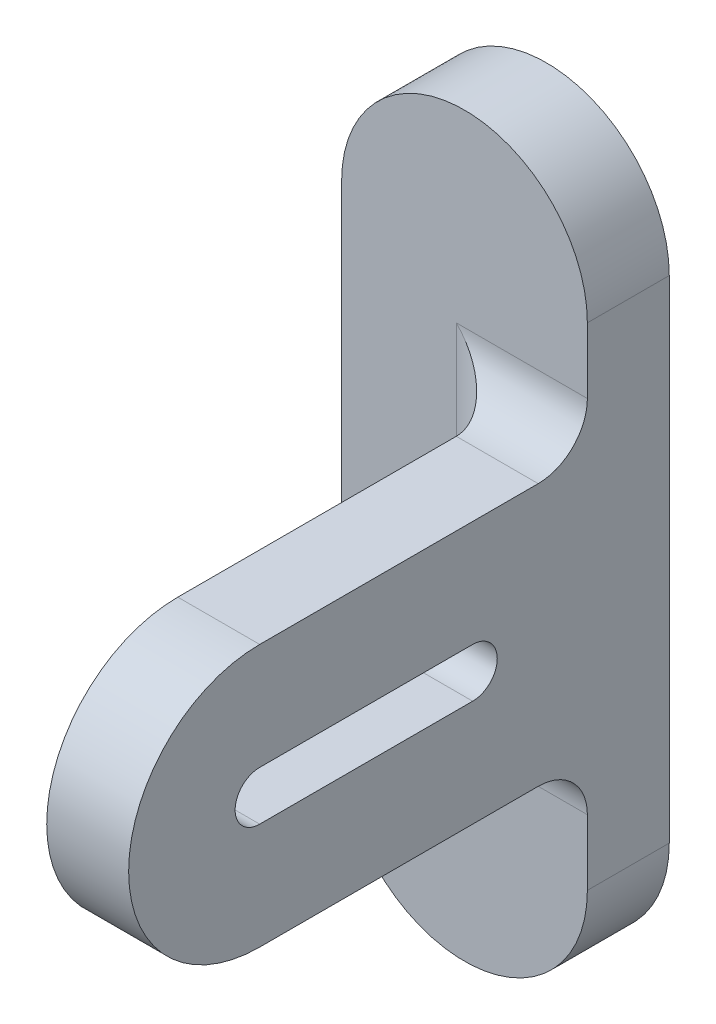
ISO-10303-21;
HEADER;
FILE_DESCRIPTION(('STEP AP214'),'2;1');
FILE_NAME('part.step','',(''),(''),'','','');
FILE_SCHEMA(('AUTOMOTIVE_DESIGN { 1 0 10303 214 1 1 1 1 }'));
ENDSEC;
DATA;
#1=APPLICATION_CONTEXT('core data for automotive mechanical design processes');
#2=APPLICATION_PROTOCOL_DEFINITION('international standard','automotive_design',2000,#1);
#3=PRODUCT_CONTEXT('',#1,'mechanical');
#4=PRODUCT('Part','Part','',(#3));
#5=PRODUCT_RELATED_PRODUCT_CATEGORY('part','',(#4));
#6=PRODUCT_DEFINITION_FORMATION('','',#4);
#7=PRODUCT_DEFINITION_CONTEXT('part definition',#1,'design');
#8=PRODUCT_DEFINITION('design','',#6,#7);
#9=PRODUCT_DEFINITION_SHAPE('','',#8);
#10=(LENGTH_UNIT() NAMED_UNIT(*) SI_UNIT(.MILLI.,.METRE.));
#11=(NAMED_UNIT(*) PLANE_ANGLE_UNIT() SI_UNIT($,.RADIAN.));
#12=(NAMED_UNIT(*) SI_UNIT($,.STERADIAN.) SOLID_ANGLE_UNIT());
#13=UNCERTAINTY_MEASURE_WITH_UNIT(LENGTH_MEASURE(1.E-05),#10,'distance_accuracy_value','');
#14=(GEOMETRIC_REPRESENTATION_CONTEXT(3) GLOBAL_UNCERTAINTY_ASSIGNED_CONTEXT((#13)) GLOBAL_UNIT_ASSIGNED_CONTEXT((#10,
#11,#12)) REPRESENTATION_CONTEXT('',''));
#15=CARTESIAN_POINT('',(0.,0.,0.));
#16=DIRECTION('',(0.,0.,1.));
#17=DIRECTION('',(1.,0.,0.));
#18=AXIS2_PLACEMENT_3D('',#15,#16,#17);
#19=CARTESIAN_POINT('',(-20.6017573210977,110.493831222237,5.));
#20=DIRECTION('',(0.,0.,-1.));
#21=DIRECTION('',(-1.,0.,0.));
#22=AXIS2_PLACEMENT_3D('',#19,#20,#21);
#23=CYLINDRICAL_SURFACE('',#22,7.5);
#24=CARTESIAN_POINT('',(-20.6017573210977,110.493831222237,0.));
#25=DIRECTION('',(0.,0.,1.));
#26=DIRECTION('',(1.,0.,0.));
#27=AXIS2_PLACEMENT_3D('',#24,#25,#26);
#28=CIRCLE('',#27,7.5);
#29=CARTESIAN_POINT('',(-13.1017573210977,110.493831222237,0.));
#30=VERTEX_POINT('',#29);
#31=CARTESIAN_POINT('',(-28.1017573210977,110.493831222237,0.));
#32=VERTEX_POINT('',#31);
#33=EDGE_CURVE('E233',#30,#32,#28,.T.);
#34=ORIENTED_EDGE('',*,*,#33,.T.);
#35=DIRECTION('',(0.,0.,-1.));
#36=VECTOR('',#35,1.);
#37=CARTESIAN_POINT('',(-28.1017573210977,110.493831222237,5.));
#38=LINE('',#37,#36);
#39=CARTESIAN_POINT('',(-28.1017573210977,110.493831222237,5.));
#40=VERTEX_POINT('',#39);
#41=EDGE_CURVE('E272',#40,#32,#38,.T.);
#42=ORIENTED_EDGE('',*,*,#41,.F.);
#43=CARTESIAN_POINT('',(-20.6017573210977,110.493831222237,5.));
#44=DIRECTION('',(0.,0.,1.));
#45=DIRECTION('',(1.,0.,0.));
#46=AXIS2_PLACEMENT_3D('',#43,#44,#45);
#47=CIRCLE('',#46,7.5);
#48=CARTESIAN_POINT('',(-13.1017573210977,110.493831222237,5.));
#49=VERTEX_POINT('',#48);
#50=EDGE_CURVE('E235',#49,#40,#47,.T.);
#51=ORIENTED_EDGE('',*,*,#50,.F.);
#52=DIRECTION('',(0.,0.,-1.));
#53=VECTOR('',#52,1.);
#54=CARTESIAN_POINT('',(-13.1017573210977,110.493831222237,5.));
#55=LINE('',#54,#53);
#56=EDGE_CURVE('E247',#49,#30,#55,.T.);
#57=ORIENTED_EDGE('',*,*,#56,.T.);
#58=EDGE_LOOP('',(#34,#42,#51,#57));
#59=FACE_BOUND('',#58,.T.);
#60=ADVANCED_FACE('F44',(#59),#23,.T.);
#61=CARTESIAN_POINT('',(-28.1017573210977,110.493831222237,5.));
#62=DIRECTION('',(1.,0.,0.));
#63=DIRECTION('',(0.,0.,-1.));
#64=AXIS2_PLACEMENT_3D('',#61,#62,#63);
#65=PLANE('',#64);
#66=DIRECTION('',(0.,-1.,0.));
#67=VECTOR('',#66,1.);
#68=CARTESIAN_POINT('',(-28.1017573210977,110.493831222237,0.));
#69=LINE('',#68,#67);
#70=CARTESIAN_POINT('',(-28.1017573210977,80.4938312222369,0.));
#71=VERTEX_POINT('',#70);
#72=EDGE_CURVE('E255',#32,#71,#69,.T.);
#73=ORIENTED_EDGE('',*,*,#72,.T.);
#74=DIRECTION('',(0.,0.,-1.));
#75=VECTOR('',#74,1.);
#76=CARTESIAN_POINT('',(-28.1017573210977,80.4938312222369,5.));
#77=LINE('',#76,#75);
#78=CARTESIAN_POINT('',(-28.1017573210977,80.4938312222369,5.));
#79=VERTEX_POINT('',#78);
#80=EDGE_CURVE('E270',#79,#71,#77,.T.);
#81=ORIENTED_EDGE('',*,*,#80,.F.);
#82=DIRECTION('',(0.,-1.,0.));
#83=VECTOR('',#82,1.);
#84=CARTESIAN_POINT('',(-28.1017573210977,110.493831222237,5.));
#85=LINE('',#84,#83);
#86=EDGE_CURVE('E236',#40,#79,#85,.T.);
#87=ORIENTED_EDGE('',*,*,#86,.F.);
#88=ORIENTED_EDGE('',*,*,#41,.T.);
#89=EDGE_LOOP('',(#73,#81,#87,#88));
#90=FACE_BOUND('',#89,.T.);
#91=ADVANCED_FACE('F325',(#90),#65,.F.);
#92=CARTESIAN_POINT('',(-20.6017573210977,80.4938312222369,5.));
#93=DIRECTION('',(0.,0.,-1.));
#94=DIRECTION('',(-1.,0.,0.));
#95=AXIS2_PLACEMENT_3D('',#92,#93,#94);
#96=CYLINDRICAL_SURFACE('',#95,7.50000000000001);
#97=CARTESIAN_POINT('',(-20.6017573210977,80.4938312222369,0.));
#98=DIRECTION('',(0.,0.,1.));
#99=DIRECTION('',(1.,0.,0.));
#100=AXIS2_PLACEMENT_3D('',#97,#98,#99);
#101=CIRCLE('',#100,7.50000000000001);
#102=CARTESIAN_POINT('',(-13.1017573210977,80.4938312222369,0.));
#103=VERTEX_POINT('',#102);
#104=EDGE_CURVE('E253',#71,#103,#101,.T.);
#105=ORIENTED_EDGE('',*,*,#104,.T.);
#106=DIRECTION('',(0.,0.,-1.));
#107=VECTOR('',#106,1.);
#108=CARTESIAN_POINT('',(-13.1017573210977,80.4938312222369,5.));
#109=LINE('',#108,#107);
#110=CARTESIAN_POINT('',(-13.1017573210977,80.4938312222369,5.));
#111=VERTEX_POINT('',#110);
#112=EDGE_CURVE('E264',#111,#103,#109,.T.);
#113=ORIENTED_EDGE('',*,*,#112,.F.);
#114=CARTESIAN_POINT('',(-20.6017573210977,80.4938312222369,5.));
#115=DIRECTION('',(0.,0.,1.));
#116=DIRECTION('',(1.,0.,0.));
#117=AXIS2_PLACEMENT_3D('',#114,#115,#116);
#118=CIRCLE('',#117,7.50000000000001);
#119=EDGE_CURVE('E239',#79,#111,#118,.T.);
#120=ORIENTED_EDGE('',*,*,#119,.F.);
#121=ORIENTED_EDGE('',*,*,#80,.T.);
#122=EDGE_LOOP('',(#105,#113,#120,#121));
#123=FACE_BOUND('',#122,.T.);
#124=ADVANCED_FACE('F323',(#123),#96,.T.);
#125=CARTESIAN_POINT('',(-13.1017573210977,110.493831222237,5.));
#126=DIRECTION('',(-1.,0.,0.));
#127=DIRECTION('',(0.,-1.,0.));
#128=AXIS2_PLACEMENT_3D('',#125,#126,#127);
#129=PLANE('',#128);
#130=DIRECTION('',(0.,1.,0.));
#131=VECTOR('',#130,1.);
#132=CARTESIAN_POINT('',(-13.1017573210977,110.493831222237,0.));
#133=LINE('',#132,#131);
#134=EDGE_CURVE('E240',#103,#30,#133,.T.);
#135=ORIENTED_EDGE('',*,*,#134,.T.);
#136=ORIENTED_EDGE('',*,*,#56,.F.);
#137=DIRECTION('',(0.,1.,0.));
#138=VECTOR('',#137,1.);
#139=CARTESIAN_POINT('',(-13.1017573210977,110.493831222237,5.));
#140=LINE('',#139,#138);
#141=CARTESIAN_POINT('',(-13.1017573210977,106.493831222237,5.));
#142=VERTEX_POINT('',#141);
#143=EDGE_CURVE('E243',#142,#49,#140,.T.);
#144=ORIENTED_EDGE('',*,*,#143,.F.);
#145=CARTESIAN_POINT('',(-13.1017573210977,106.493831222237,8.));
#146=DIRECTION('',(-1.,0.,0.));
#147=DIRECTION('',(0.,-1.,0.));
#148=AXIS2_PLACEMENT_3D('',#145,#146,#147);
#149=CIRCLE('',#148,3.);
#150=CARTESIAN_POINT('',(-13.1017573210977,103.493831222237,8.));
#151=VERTEX_POINT('',#150);
#152=EDGE_CURVE('E11',#142,#151,#149,.T.);
#153=ORIENTED_EDGE('',*,*,#152,.T.);
#154=DIRECTION('',(0.,0.,-1.));
#155=VECTOR('',#154,1.);
#156=CARTESIAN_POINT('',(-13.1017573210977,103.493831222237,5.));
#157=LINE('',#156,#155);
#158=CARTESIAN_POINT('',(-13.1017573210977,103.493831222237,25.));
#159=VERTEX_POINT('',#158);
#160=EDGE_CURVE('E209',#159,#151,#157,.T.);
#161=ORIENTED_EDGE('',*,*,#160,.F.);
#162=CARTESIAN_POINT('',(-13.1017573210977,95.4938312222369,25.));
#163=DIRECTION('',(-1.,0.,0.));
#164=DIRECTION('',(0.,-1.,0.));
#165=AXIS2_PLACEMENT_3D('',#162,#163,#164);
#166=CIRCLE('',#165,8.);
#167=CARTESIAN_POINT('',(-13.1017573210977,87.4938312222369,25.));
#168=VERTEX_POINT('',#167);
#169=EDGE_CURVE('E218',#168,#159,#166,.T.);
#170=ORIENTED_EDGE('',*,*,#169,.F.);
#171=DIRECTION('',(0.,0.,1.));
#172=VECTOR('',#171,1.);
#173=CARTESIAN_POINT('',(-13.1017573210977,87.4938312222369,4.99999999999998));
#174=LINE('',#173,#172);
#175=CARTESIAN_POINT('',(-13.1017573210977,87.4938312222369,8.));
#176=VERTEX_POINT('',#175);
#177=EDGE_CURVE('E171',#176,#168,#174,.T.);
#178=ORIENTED_EDGE('',*,*,#177,.F.);
#179=CARTESIAN_POINT('',(-13.1017573210977,84.4938312222369,8.));
#180=DIRECTION('',(-1.,0.,0.));
#181=DIRECTION('',(0.,-1.,0.));
#182=AXIS2_PLACEMENT_3D('',#179,#180,#181);
#183=CIRCLE('',#182,3.);
#184=CARTESIAN_POINT('',(-13.1017573210977,84.4938312222369,5.));
#185=VERTEX_POINT('',#184);
#186=EDGE_CURVE('E54',#176,#185,#183,.T.);
#187=ORIENTED_EDGE('',*,*,#186,.T.);
#188=EDGE_CURVE('E242',#111,#185,#140,.T.);
#189=ORIENTED_EDGE('',*,*,#188,.F.);
#190=ORIENTED_EDGE('',*,*,#112,.T.);
#191=EDGE_LOOP('',(#135,#136,#144,#153,#161,#170,#178,#187,#189,#190));
#192=FACE_BOUND('',#191,.T.);
#193=DIRECTION('',(0.,0.,1.));
#194=VECTOR('',#193,1.);
#195=CARTESIAN_POINT('',(-13.1017573210977,93.9938312222369,5.));
#196=LINE('',#195,#194);
#197=CARTESIAN_POINT('',(-13.1017573210977,93.9938312222369,12.));
#198=VERTEX_POINT('',#197);
#199=CARTESIAN_POINT('',(-13.1017573210977,93.9938312222369,25.));
#200=VERTEX_POINT('',#199);
#201=EDGE_CURVE('E187',#198,#200,#196,.T.);
#202=ORIENTED_EDGE('',*,*,#201,.T.);
#203=CARTESIAN_POINT('',(-13.1017573210977,95.4938312222369,25.));
#204=DIRECTION('',(-1.,0.,0.));
#205=DIRECTION('',(0.,-1.,0.));
#206=AXIS2_PLACEMENT_3D('',#203,#204,#205);
#207=CIRCLE('',#206,1.5);
#208=CARTESIAN_POINT('',(-13.1017573210977,96.9938312222369,25.));
#209=VERTEX_POINT('',#208);
#210=EDGE_CURVE('E169',#200,#209,#207,.T.);
#211=ORIENTED_EDGE('',*,*,#210,.T.);
#212=DIRECTION('',(0.,0.,-1.));
#213=VECTOR('',#212,1.);
#214=CARTESIAN_POINT('',(-13.1017573210977,96.9938312222369,5.));
#215=LINE('',#214,#213);
#216=CARTESIAN_POINT('',(-13.1017573210977,96.9938312222369,12.));
#217=VERTEX_POINT('',#216);
#218=EDGE_CURVE('E192',#209,#217,#215,.T.);
#219=ORIENTED_EDGE('',*,*,#218,.T.);
#220=CARTESIAN_POINT('',(-13.1017573210977,95.4938312222369,12.));
#221=DIRECTION('',(-1.,0.,0.));
#222=DIRECTION('',(0.,-1.,0.));
#223=AXIS2_PLACEMENT_3D('',#220,#221,#222);
#224=CIRCLE('',#223,1.5);
#225=EDGE_CURVE('E161',#217,#198,#224,.T.);
#226=ORIENTED_EDGE('',*,*,#225,.T.);
#227=EDGE_LOOP('',(#202,#211,#219,#226));
#228=FACE_BOUND('',#227,.T.);
#229=ADVANCED_FACE('F309',(#192,#228),#129,.F.);
#230=CARTESIAN_POINT('',(-20.6017573210977,110.493831222237,5.));
#231=DIRECTION('',(0.,0.,1.));
#232=DIRECTION('',(1.,0.,0.));
#233=AXIS2_PLACEMENT_3D('',#230,#231,#232);
#234=PLANE('',#233);
#235=ORIENTED_EDGE('',*,*,#188,.T.);
#236=DIRECTION('',(1.,0.,0.));
#237=VECTOR('',#236,1.);
#238=CARTESIAN_POINT('',(-20.6017573210977,84.4938312222369,5.));
#239=LINE('',#238,#237);
#240=CARTESIAN_POINT('',(-21.1017573210977,84.4938312222369,5.));
#241=VERTEX_POINT('',#240);
#242=EDGE_CURVE('E285',#185,#241,#239,.F.);
#243=ORIENTED_EDGE('',*,*,#242,.T.);
#244=DIRECTION('',(0.,-1.,0.));
#245=VECTOR('',#244,1.);
#246=CARTESIAN_POINT('',(-21.1017573210977,103.493831222237,5.));
#247=LINE('',#246,#245);
#248=CARTESIAN_POINT('',(-21.1017573210977,106.493831222237,5.));
#249=VERTEX_POINT('',#248);
#250=EDGE_CURVE('E282',#241,#249,#247,.F.);
#251=ORIENTED_EDGE('',*,*,#250,.T.);
#252=DIRECTION('',(1.,0.,0.));
#253=VECTOR('',#252,1.);
#254=CARTESIAN_POINT('',(-20.6017573210977,106.493831222237,5.));
#255=LINE('',#254,#253);
#256=EDGE_CURVE('E276',#249,#142,#255,.T.);
#257=ORIENTED_EDGE('',*,*,#256,.T.);
#258=ORIENTED_EDGE('',*,*,#143,.T.);
#259=ORIENTED_EDGE('',*,*,#50,.T.);
#260=ORIENTED_EDGE('',*,*,#86,.T.);
#261=ORIENTED_EDGE('',*,*,#119,.T.);
#262=EDGE_LOOP('',(#235,#243,#251,#257,#258,#259,#260,#261));
#263=FACE_BOUND('',#262,.T.);
#264=ADVANCED_FACE('F308',(#263),#234,.T.);
#265=CARTESIAN_POINT('',(-20.6017573210977,110.493831222237,0.));
#266=DIRECTION('',(0.,0.,1.));
#267=DIRECTION('',(1.,0.,0.));
#268=AXIS2_PLACEMENT_3D('',#265,#266,#267);
#269=PLANE('',#268);
#270=ORIENTED_EDGE('',*,*,#33,.F.);
#271=ORIENTED_EDGE('',*,*,#134,.F.);
#272=ORIENTED_EDGE('',*,*,#104,.F.);
#273=ORIENTED_EDGE('',*,*,#72,.F.);
#274=EDGE_LOOP('',(#270,#271,#272,#273));
#275=FACE_BOUND('',#274,.T.);
#276=ADVANCED_FACE('F385',(#275),#269,.F.);
#277=CARTESIAN_POINT('',(-18.1017573210977,95.4938312222369,25.));
#278=DIRECTION('',(-1.,0.,0.));
#279=DIRECTION('',(0.,-1.,0.));
#280=AXIS2_PLACEMENT_3D('',#277,#278,#279);
#281=PLANE('',#280);
#282=DIRECTION('',(0.,0.,-1.));
#283=VECTOR('',#282,1.);
#284=CARTESIAN_POINT('',(-18.1017573210977,103.493831222237,5.));
#285=LINE('',#284,#283);
#286=CARTESIAN_POINT('',(-18.1017573210977,103.493831222237,25.));
#287=VERTEX_POINT('',#286);
#288=CARTESIAN_POINT('',(-18.1017573210977,103.493831222237,8.));
#289=VERTEX_POINT('',#288);
#290=EDGE_CURVE('E215',#287,#289,#285,.T.);
#291=ORIENTED_EDGE('',*,*,#290,.T.);
#292=DIRECTION('',(0.,-1.,0.));
#293=VECTOR('',#292,1.);
#294=CARTESIAN_POINT('',(-18.1017573210977,87.4938312222369,8.));
#295=LINE('',#294,#293);
#296=CARTESIAN_POINT('',(-18.1017573210977,87.4938312222369,8.));
#297=VERTEX_POINT('',#296);
#298=EDGE_CURVE('E273',#289,#297,#295,.T.);
#299=ORIENTED_EDGE('',*,*,#298,.T.);
#300=DIRECTION('',(0.,0.,1.));
#301=VECTOR('',#300,1.);
#302=CARTESIAN_POINT('',(-18.1017573210977,87.4938312222369,4.99999999999998));
#303=LINE('',#302,#301);
#304=CARTESIAN_POINT('',(-18.1017573210977,87.4938312222369,25.));
#305=VERTEX_POINT('',#304);
#306=EDGE_CURVE('E203',#297,#305,#303,.T.);
#307=ORIENTED_EDGE('',*,*,#306,.T.);
#308=CARTESIAN_POINT('',(-18.1017573210977,95.4938312222369,25.));
#309=DIRECTION('',(-1.,0.,0.));
#310=DIRECTION('',(0.,-1.,0.));
#311=AXIS2_PLACEMENT_3D('',#308,#309,#310);
#312=CIRCLE('',#311,8.);
#313=EDGE_CURVE('E206',#305,#287,#312,.T.);
#314=ORIENTED_EDGE('',*,*,#313,.T.);
#315=EDGE_LOOP('',(#291,#299,#307,#314));
#316=FACE_BOUND('',#315,.T.);
#317=CARTESIAN_POINT('',(-18.1017573210977,95.4938312222369,25.));
#318=DIRECTION('',(-1.,0.,0.));
#319=DIRECTION('',(0.,-1.,0.));
#320=AXIS2_PLACEMENT_3D('',#317,#318,#319);
#321=CIRCLE('',#320,1.5);
#322=CARTESIAN_POINT('',(-18.1017573210977,93.9938312222369,25.));
#323=VERTEX_POINT('',#322);
#324=CARTESIAN_POINT('',(-18.1017573210977,96.9938312222369,25.));
#325=VERTEX_POINT('',#324);
#326=EDGE_CURVE('E162',#323,#325,#321,.T.);
#327=ORIENTED_EDGE('',*,*,#326,.F.);
#328=DIRECTION('',(0.,0.,1.));
#329=VECTOR('',#328,1.);
#330=CARTESIAN_POINT('',(-18.1017573210977,93.9938312222369,5.));
#331=LINE('',#330,#329);
#332=CARTESIAN_POINT('',(-18.1017573210977,93.9938312222369,12.));
#333=VERTEX_POINT('',#332);
#334=EDGE_CURVE('E151',#333,#323,#331,.T.);
#335=ORIENTED_EDGE('',*,*,#334,.F.);
#336=CARTESIAN_POINT('',(-18.1017573210977,95.4938312222369,12.));
#337=DIRECTION('',(-1.,0.,0.));
#338=DIRECTION('',(0.,-1.,0.));
#339=AXIS2_PLACEMENT_3D('',#336,#337,#338);
#340=CIRCLE('',#339,1.5);
#341=CARTESIAN_POINT('',(-18.1017573210977,96.9938312222369,12.));
#342=VERTEX_POINT('',#341);
#343=EDGE_CURVE('E181',#342,#333,#340,.T.);
#344=ORIENTED_EDGE('',*,*,#343,.F.);
#345=DIRECTION('',(0.,0.,-1.));
#346=VECTOR('',#345,1.);
#347=CARTESIAN_POINT('',(-18.1017573210977,96.9938312222369,5.));
#348=LINE('',#347,#346);
#349=EDGE_CURVE('E180',#325,#342,#348,.T.);
#350=ORIENTED_EDGE('',*,*,#349,.F.);
#351=EDGE_LOOP('',(#327,#335,#344,#350));
#352=FACE_BOUND('',#351,.T.);
#353=ADVANCED_FACE('F174',(#316,#352),#281,.T.);
#354=CARTESIAN_POINT('',(-18.1017573210977,87.4938312222369,4.99999999999998));
#355=DIRECTION('',(0.,1.,0.));
#356=DIRECTION('',(0.,0.,1.));
#357=AXIS2_PLACEMENT_3D('',#354,#355,#356);
#358=PLANE('',#357);
#359=ORIENTED_EDGE('',*,*,#306,.F.);
#360=DIRECTION('',(1.,0.,0.));
#361=VECTOR('',#360,1.);
#362=CARTESIAN_POINT('',(-18.1017573210977,87.4938312222369,8.));
#363=LINE('',#362,#361);
#364=EDGE_CURVE('E68',#297,#176,#363,.T.);
#365=ORIENTED_EDGE('',*,*,#364,.T.);
#366=ORIENTED_EDGE('',*,*,#177,.T.);
#367=DIRECTION('',(1.,0.,0.));
#368=VECTOR('',#367,1.);
#369=CARTESIAN_POINT('',(-18.1017573210977,87.4938312222369,25.));
#370=LINE('',#369,#368);
#371=EDGE_CURVE('E227',#305,#168,#370,.T.);
#372=ORIENTED_EDGE('',*,*,#371,.F.);
#373=EDGE_LOOP('',(#359,#365,#366,#372));
#374=FACE_BOUND('',#373,.T.);
#375=ADVANCED_FACE('F333',(#374),#358,.F.);
#376=CARTESIAN_POINT('',(-18.1017573210977,95.4938312222369,25.));
#377=DIRECTION('',(1.,0.,0.));
#378=DIRECTION('',(0.,0.,-1.));
#379=AXIS2_PLACEMENT_3D('',#376,#377,#378);
#380=CYLINDRICAL_SURFACE('',#379,8.);
#381=ORIENTED_EDGE('',*,*,#169,.T.);
#382=DIRECTION('',(1.,0.,0.));
#383=VECTOR('',#382,1.);
#384=CARTESIAN_POINT('',(-18.1017573210977,103.493831222237,25.));
#385=LINE('',#384,#383);
#386=EDGE_CURVE('E216',#287,#159,#385,.T.);
#387=ORIENTED_EDGE('',*,*,#386,.F.);
#388=ORIENTED_EDGE('',*,*,#313,.F.);
#389=ORIENTED_EDGE('',*,*,#371,.T.);
#390=EDGE_LOOP('',(#381,#387,#388,#389));
#391=FACE_BOUND('',#390,.T.);
#392=ADVANCED_FACE('F336',(#391),#380,.T.);
#393=CARTESIAN_POINT('',(-18.1017573210977,103.493831222237,5.));
#394=DIRECTION('',(0.,-1.,0.));
#395=DIRECTION('',(0.,0.,-1.));
#396=AXIS2_PLACEMENT_3D('',#393,#394,#395);
#397=PLANE('',#396);
#398=ORIENTED_EDGE('',*,*,#160,.T.);
#399=DIRECTION('',(1.,0.,0.));
#400=VECTOR('',#399,1.);
#401=CARTESIAN_POINT('',(-18.1017573210977,103.493831222237,8.));
#402=LINE('',#401,#400);
#403=EDGE_CURVE('E288',#151,#289,#402,.F.);
#404=ORIENTED_EDGE('',*,*,#403,.T.);
#405=ORIENTED_EDGE('',*,*,#290,.F.);
#406=ORIENTED_EDGE('',*,*,#386,.T.);
#407=EDGE_LOOP('',(#398,#404,#405,#406));
#408=FACE_BOUND('',#407,.T.);
#409=ADVANCED_FACE('F342',(#408),#397,.F.);
#410=CARTESIAN_POINT('',(-18.1017573210977,93.9938312222369,5.));
#411=DIRECTION('',(0.,1.,0.));
#412=DIRECTION('',(0.,0.,1.));
#413=AXIS2_PLACEMENT_3D('',#410,#411,#412);
#414=PLANE('',#413);
#415=ORIENTED_EDGE('',*,*,#201,.F.);
#416=DIRECTION('',(1.,0.,0.));
#417=VECTOR('',#416,1.);
#418=CARTESIAN_POINT('',(-18.1017573210977,93.9938312222369,12.));
#419=LINE('',#418,#417);
#420=EDGE_CURVE('E160',#333,#198,#419,.T.);
#421=ORIENTED_EDGE('',*,*,#420,.F.);
#422=ORIENTED_EDGE('',*,*,#334,.T.);
#423=DIRECTION('',(1.,0.,0.));
#424=VECTOR('',#423,1.);
#425=CARTESIAN_POINT('',(-18.1017573210977,93.9938312222369,25.));
#426=LINE('',#425,#424);
#427=EDGE_CURVE('E153',#323,#200,#426,.T.);
#428=ORIENTED_EDGE('',*,*,#427,.T.);
#429=EDGE_LOOP('',(#415,#421,#422,#428));
#430=FACE_BOUND('',#429,.T.);
#431=ADVANCED_FACE('F154',(#430),#414,.T.);
#432=CARTESIAN_POINT('',(-18.1017573210977,95.4938312222369,25.));
#433=DIRECTION('',(1.,0.,0.));
#434=DIRECTION('',(0.,0.,-1.));
#435=AXIS2_PLACEMENT_3D('',#432,#433,#434);
#436=CYLINDRICAL_SURFACE('',#435,1.5);
#437=ORIENTED_EDGE('',*,*,#210,.F.);
#438=ORIENTED_EDGE('',*,*,#427,.F.);
#439=ORIENTED_EDGE('',*,*,#326,.T.);
#440=DIRECTION('',(1.,0.,0.));
#441=VECTOR('',#440,1.);
#442=CARTESIAN_POINT('',(-18.1017573210977,96.9938312222369,25.));
#443=LINE('',#442,#441);
#444=EDGE_CURVE('E175',#325,#209,#443,.T.);
#445=ORIENTED_EDGE('',*,*,#444,.T.);
#446=EDGE_LOOP('',(#437,#438,#439,#445));
#447=FACE_BOUND('',#446,.T.);
#448=ADVANCED_FACE('F168',(#447),#436,.F.);
#449=CARTESIAN_POINT('',(-18.1017573210977,96.9938312222369,5.));
#450=DIRECTION('',(0.,-1.,0.));
#451=DIRECTION('',(0.,0.,-1.));
#452=AXIS2_PLACEMENT_3D('',#449,#450,#451);
#453=PLANE('',#452);
#454=ORIENTED_EDGE('',*,*,#218,.F.);
#455=ORIENTED_EDGE('',*,*,#444,.F.);
#456=ORIENTED_EDGE('',*,*,#349,.T.);
#457=DIRECTION('',(1.,0.,0.));
#458=VECTOR('',#457,1.);
#459=CARTESIAN_POINT('',(-18.1017573210977,96.9938312222369,12.));
#460=LINE('',#459,#458);
#461=EDGE_CURVE('E200',#342,#217,#460,.T.);
#462=ORIENTED_EDGE('',*,*,#461,.T.);
#463=EDGE_LOOP('',(#454,#455,#456,#462));
#464=FACE_BOUND('',#463,.T.);
#465=ADVANCED_FACE('F367',(#464),#453,.T.);
#466=CARTESIAN_POINT('',(-18.1017573210977,95.4938312222369,12.));
#467=DIRECTION('',(1.,0.,0.));
#468=DIRECTION('',(0.,0.,-1.));
#469=AXIS2_PLACEMENT_3D('',#466,#467,#468);
#470=CYLINDRICAL_SURFACE('',#469,1.5);
#471=ORIENTED_EDGE('',*,*,#225,.F.);
#472=ORIENTED_EDGE('',*,*,#461,.F.);
#473=ORIENTED_EDGE('',*,*,#343,.T.);
#474=ORIENTED_EDGE('',*,*,#420,.T.);
#475=EDGE_LOOP('',(#471,#472,#473,#474));
#476=FACE_BOUND('',#475,.T.);
#477=ADVANCED_FACE('F362',(#476),#470,.F.);
#478=CARTESIAN_POINT('',(-20.6017573210977,106.493831222237,8.));
#479=DIRECTION('',(1.,0.,0.));
#480=DIRECTION('',(0.,0.,-1.));
#481=AXIS2_PLACEMENT_3D('',#478,#479,#480);
#482=CYLINDRICAL_SURFACE('',#481,3.);
#483=ORIENTED_EDGE('',*,*,#152,.F.);
#484=ORIENTED_EDGE('',*,*,#256,.F.);
#485=CARTESIAN_POINT('',(-21.1017573210977,106.493831222237,8.));
#486=DIRECTION('',(0.707106781186547,0.707106781186548,0.));
#487=DIRECTION('',(0.707106781186548,-0.707106781186547,0.));
#488=AXIS2_PLACEMENT_3D('',#485,#486,#487);
#489=ELLIPSE('',#488,4.24264068711929,3.);
#490=EDGE_CURVE('E47',#289,#249,#489,.T.);
#491=ORIENTED_EDGE('',*,*,#490,.F.);
#492=ORIENTED_EDGE('',*,*,#403,.F.);
#493=EDGE_LOOP('',(#483,#484,#491,#492));
#494=FACE_BOUND('',#493,.T.);
#495=ADVANCED_FACE('F50',(#494),#482,.F.);
#496=CARTESIAN_POINT('',(-18.1017573210977,84.4938312222369,8.));
#497=DIRECTION('',(1.,0.,0.));
#498=DIRECTION('',(0.,0.,-1.));
#499=AXIS2_PLACEMENT_3D('',#496,#497,#498);
#500=CYLINDRICAL_SURFACE('',#499,3.);
#501=ORIENTED_EDGE('',*,*,#186,.F.);
#502=ORIENTED_EDGE('',*,*,#364,.F.);
#503=CARTESIAN_POINT('',(-21.1017573210977,84.4938312222369,8.));
#504=DIRECTION('',(0.707106781186548,-0.707106781186547,0.));
#505=DIRECTION('',(0.707106781186547,0.707106781186548,0.));
#506=AXIS2_PLACEMENT_3D('',#503,#504,#505);
#507=ELLIPSE('',#506,4.24264068711928,3.);
#508=EDGE_CURVE('E295',#241,#297,#507,.T.);
#509=ORIENTED_EDGE('',*,*,#508,.F.);
#510=ORIENTED_EDGE('',*,*,#242,.F.);
#511=EDGE_LOOP('',(#501,#502,#509,#510));
#512=FACE_BOUND('',#511,.T.);
#513=ADVANCED_FACE('F330',(#512),#500,.F.);
#514=CARTESIAN_POINT('',(-21.1017573210977,95.4938312222369,8.));
#515=DIRECTION('',(0.,1.,0.));
#516=DIRECTION('',(-1.,0.,0.));
#517=AXIS2_PLACEMENT_3D('',#514,#515,#516);
#518=CYLINDRICAL_SURFACE('',#517,3.);
#519=ORIENTED_EDGE('',*,*,#490,.T.);
#520=ORIENTED_EDGE('',*,*,#250,.F.);
#521=ORIENTED_EDGE('',*,*,#508,.T.);
#522=ORIENTED_EDGE('',*,*,#298,.F.);
#523=EDGE_LOOP('',(#519,#520,#521,#522));
#524=FACE_BOUND('',#523,.T.);
#525=ADVANCED_FACE('F303',(#524),#518,.F.);
#526=CLOSED_SHELL('',(#60,#91,#124,#229,#264,#276,#353,#375,#392,#409,#431,#448,#465,#477,#495,
#513,#525));
#527=MANIFOLD_SOLID_BREP('B2',#526);
#528=ADVANCED_BREP_SHAPE_REPRESENTATION('',(#18,#527),#14);
#529=SHAPE_DEFINITION_REPRESENTATION(#9,#528);
ENDSEC;
END-ISO-10303-21;
